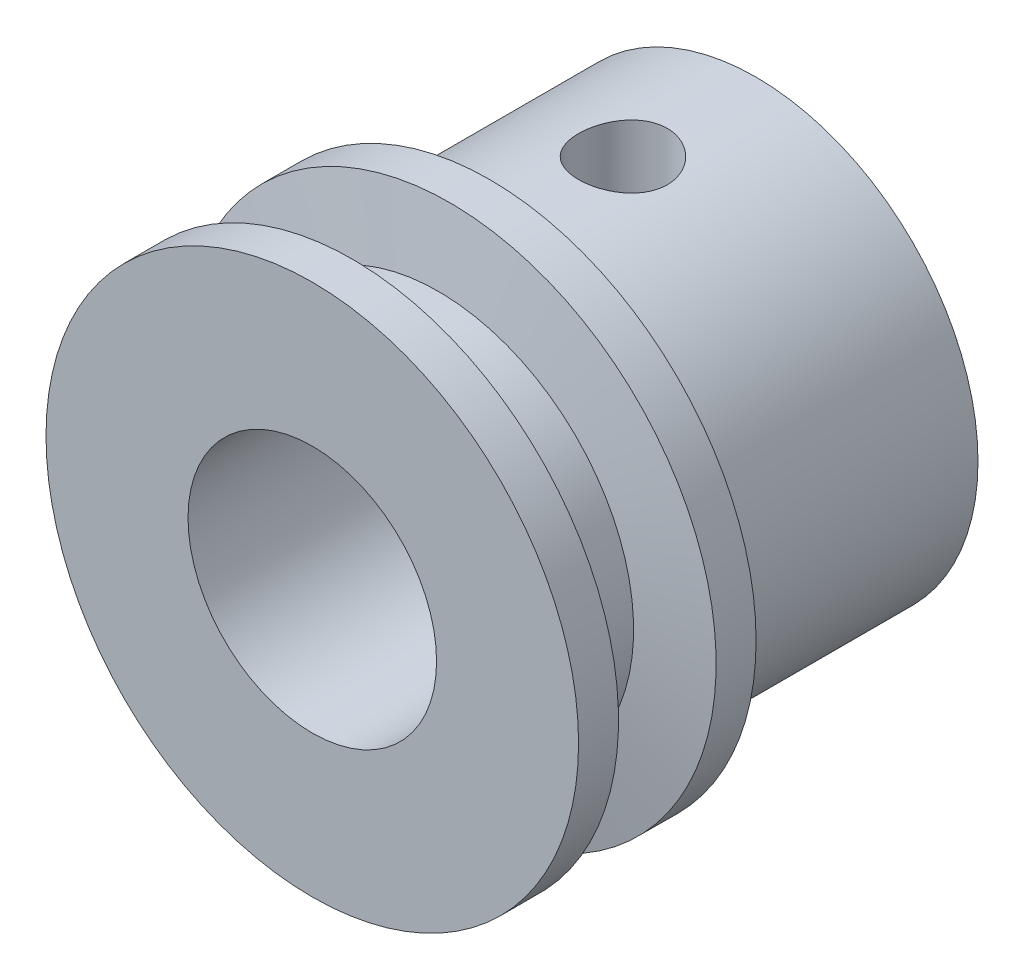
ISO-10303-21;
HEADER;
FILE_DESCRIPTION(('STEP AP214'),'2;1');
FILE_NAME('part.step','',(''),(''),'','','');
FILE_SCHEMA(('AUTOMOTIVE_DESIGN { 1 0 10303 214 1 1 1 1 }'));
ENDSEC;
DATA;
#1=APPLICATION_CONTEXT('core data for automotive mechanical design processes');
#2=APPLICATION_PROTOCOL_DEFINITION('international standard','automotive_design',2000,#1);
#3=PRODUCT_CONTEXT('',#1,'mechanical');
#4=PRODUCT('Part','Part','',(#3));
#5=PRODUCT_RELATED_PRODUCT_CATEGORY('part','',(#4));
#6=PRODUCT_DEFINITION_FORMATION('','',#4);
#7=PRODUCT_DEFINITION_CONTEXT('part definition',#1,'design');
#8=PRODUCT_DEFINITION('design','',#6,#7);
#9=PRODUCT_DEFINITION_SHAPE('','',#8);
#10=(LENGTH_UNIT() NAMED_UNIT(*) SI_UNIT(.MILLI.,.METRE.));
#11=(NAMED_UNIT(*) PLANE_ANGLE_UNIT() SI_UNIT($,.RADIAN.));
#12=(NAMED_UNIT(*) SI_UNIT($,.STERADIAN.) SOLID_ANGLE_UNIT());
#13=UNCERTAINTY_MEASURE_WITH_UNIT(LENGTH_MEASURE(1.E-05),#10,'distance_accuracy_value','');
#14=(GEOMETRIC_REPRESENTATION_CONTEXT(3) GLOBAL_UNCERTAINTY_ASSIGNED_CONTEXT((#13)) GLOBAL_UNIT_ASSIGNED_CONTEXT((#10,
#11,#12)) REPRESENTATION_CONTEXT('',''));
#15=CARTESIAN_POINT('',(0.,0.,0.));
#16=DIRECTION('',(0.,0.,1.));
#17=DIRECTION('',(1.,0.,0.));
#18=AXIS2_PLACEMENT_3D('',#15,#16,#17);
#19=CARTESIAN_POINT('',(0.,0.,10.));
#20=DIRECTION('',(0.,0.,-1.));
#21=DIRECTION('',(-1.,0.,0.));
#22=AXIS2_PLACEMENT_3D('',#19,#20,#21);
#23=CYLINDRICAL_SURFACE('',#22,15.);
#24=CARTESIAN_POINT('',(0.,0.,2.25));
#25=DIRECTION('',(0.,0.,-1.));
#26=DIRECTION('',(-1.,0.,0.));
#27=AXIS2_PLACEMENT_3D('',#24,#25,#26);
#28=CIRCLE('',#27,15.);
#29=CARTESIAN_POINT('',(-15.,0.,2.25));
#30=VERTEX_POINT('',#29);
#31=EDGE_CURVE('E61',#30,#30,#28,.T.);
#32=ORIENTED_EDGE('',*,*,#31,.T.);
#33=EDGE_LOOP('',(#32));
#34=FACE_BOUND('',#33,.T.);
#35=CARTESIAN_POINT('',(0.,0.,0.));
#36=DIRECTION('',(0.,0.,1.));
#37=DIRECTION('',(1.,0.,0.));
#38=AXIS2_PLACEMENT_3D('',#35,#36,#37);
#39=CIRCLE('',#38,15.);
#40=CARTESIAN_POINT('',(15.,0.,0.));
#41=VERTEX_POINT('',#40);
#42=EDGE_CURVE('E55',#41,#41,#39,.T.);
#43=ORIENTED_EDGE('',*,*,#42,.T.);
#44=EDGE_LOOP('',(#43));
#45=FACE_BOUND('',#44,.T.);
#46=ADVANCED_FACE('F34',(#34,#45),#23,.T.);
#47=CARTESIAN_POINT('',(0.,0.,10.));
#48=DIRECTION('',(0.,0.,1.));
#49=DIRECTION('',(1.,0.,0.));
#50=AXIS2_PLACEMENT_3D('',#47,#48,#49);
#51=PLANE('',#50);
#52=CARTESIAN_POINT('',(0.,0.,10.));
#53=DIRECTION('',(0.,0.,1.));
#54=DIRECTION('',(1.,0.,0.));
#55=AXIS2_PLACEMENT_3D('',#52,#53,#54);
#56=CIRCLE('',#55,15.);
#57=CARTESIAN_POINT('',(15.,0.,10.));
#58=VERTEX_POINT('',#57);
#59=EDGE_CURVE('E50',#58,#58,#56,.T.);
#60=ORIENTED_EDGE('',*,*,#59,.T.);
#61=EDGE_LOOP('',(#60));
#62=FACE_BOUND('',#61,.T.);
#63=CARTESIAN_POINT('',(0.,0.,10.));
#64=DIRECTION('',(0.,0.,1.));
#65=DIRECTION('',(1.,0.,0.));
#66=AXIS2_PLACEMENT_3D('',#63,#64,#65);
#67=CIRCLE('',#66,7.);
#68=CARTESIAN_POINT('',(7.,0.,10.));
#69=VERTEX_POINT('',#68);
#70=EDGE_CURVE('E73',#69,#69,#67,.T.);
#71=ORIENTED_EDGE('',*,*,#70,.F.);
#72=EDGE_LOOP('',(#71));
#73=FACE_BOUND('',#72,.T.);
#74=ADVANCED_FACE('F81',(#62,#73),#51,.T.);
#75=CARTESIAN_POINT('',(0.,0.,0.));
#76=DIRECTION('',(0.,0.,1.));
#77=DIRECTION('',(1.,0.,0.));
#78=AXIS2_PLACEMENT_3D('',#75,#76,#77);
#79=PLANE('',#78);
#80=CARTESIAN_POINT('',(0.,0.,0.));
#81=DIRECTION('',(0.,0.,-1.));
#82=DIRECTION('',(-1.,0.,0.));
#83=AXIS2_PLACEMENT_3D('',#80,#81,#82);
#84=CIRCLE('',#83,12.5);
#85=CARTESIAN_POINT('',(-12.5,0.,0.));
#86=VERTEX_POINT('',#85);
#87=EDGE_CURVE('E46',#86,#86,#84,.T.);
#88=ORIENTED_EDGE('',*,*,#87,.F.);
#89=EDGE_LOOP('',(#88));
#90=FACE_BOUND('',#89,.T.);
#91=ORIENTED_EDGE('',*,*,#42,.F.);
#92=EDGE_LOOP('',(#91));
#93=FACE_BOUND('',#92,.T.);
#94=ADVANCED_FACE('F79',(#90,#93),#79,.F.);
#95=CARTESIAN_POINT('',(0.,0.,7.75));
#96=DIRECTION('',(0.,0.,-1.));
#97=DIRECTION('',(-1.,0.,0.));
#98=AXIS2_PLACEMENT_3D('',#95,#96,#97);
#99=CIRCLE('',#98,15.);
#100=CARTESIAN_POINT('',(-15.,0.,7.75));
#101=VERTEX_POINT('',#100);
#102=EDGE_CURVE('E64',#101,#101,#99,.T.);
#103=ORIENTED_EDGE('',*,*,#102,.F.);
#104=EDGE_LOOP('',(#103));
#105=FACE_BOUND('',#104,.T.);
#106=ORIENTED_EDGE('',*,*,#59,.F.);
#107=EDGE_LOOP('',(#106));
#108=FACE_BOUND('',#107,.T.);
#109=ADVANCED_FACE('F36',(#105,#108),#23,.T.);
#110=CARTESIAN_POINT('',(0.,0.,10.));
#111=DIRECTION('',(0.,0.,-1.));
#112=DIRECTION('',(-1.,0.,0.));
#113=AXIS2_PLACEMENT_3D('',#110,#111,#112);
#114=CYLINDRICAL_SURFACE('',#113,7.);
#115=CARTESIAN_POINT('',(0.,7.,-5.00000000000001));
#116=CARTESIAN_POINT('',(-0.135839760518734,7.0000020295295,-4.99999717595815));
#117=CARTESIAN_POINT('',(-0.27165942994753,6.99601056603649,-5.01110675723282));
#118=CARTESIAN_POINT('',(-0.539264896606896,6.98048404948616,-5.05509128719208));
#119=CARTESIAN_POINT('',(-0.671050847614627,6.96894928437749,-5.08796540506481));
#120=CARTESIAN_POINT('',(-0.926692116674315,6.93958109810981,-5.17418514126746));
#121=CARTESIAN_POINT('',(-1.05056137145919,6.92175912724346,-5.22749355971995));
#122=CARTESIAN_POINT('',(-1.28759585298401,6.88161078032354,-5.35288871936762));
#123=CARTESIAN_POINT('',(-1.40075850640074,6.85928332539979,-5.42497995944901));
#124=CARTESIAN_POINT('',(-1.61758802805346,6.81147377429754,-5.5888431321164));
#125=CARTESIAN_POINT('',(-1.72078015672851,6.78590827445072,-5.68121873100537));
#126=CARTESIAN_POINT('',(-1.9105819932243,6.73493522536265,-5.8817463637898));
#127=CARTESIAN_POINT('',(-1.99718728701346,6.70952771990194,-5.98990258371639));
#128=CARTESIAN_POINT('',(-2.15423735561842,6.6608007016897,-6.22339779277569));
#129=CARTESIAN_POINT('',(-2.22403529794829,6.63758107761794,-6.34919474351648));
#130=CARTESIAN_POINT('',(-2.34127572230002,6.59714352451506,-6.61170366470435));
#131=CARTESIAN_POINT('',(-2.38872619231545,6.57992345154766,-6.74841171456772));
#132=CARTESIAN_POINT('',(-2.45809130448527,6.55432038222057,-7.02342283620247));
#133=CARTESIAN_POINT('',(-2.48090519407331,6.54562733379003,-7.16146930694311));
#134=CARTESIAN_POINT('',(-2.5031615222748,6.53715061879806,-7.4396836318238));
#135=CARTESIAN_POINT('',(-2.50261249605973,6.53736369856128,-7.57985069254155));
#136=CARTESIAN_POINT('',(-2.4788507897233,6.54640588297195,-7.85035565505249));
#137=CARTESIAN_POINT('',(-2.45685161763647,6.5547736366904,-7.98081835299974));
#138=CARTESIAN_POINT('',(-2.39280851055059,6.57842082174383,-8.23606152718334));
#139=CARTESIAN_POINT('',(-2.35076183734613,6.59370119723067,-8.36084122465079));
#140=CARTESIAN_POINT('',(-2.24709566844099,6.62975170487814,-8.60377374578571));
#141=CARTESIAN_POINT('',(-2.18514195933255,6.65061447775042,-8.72176960265853));
#142=CARTESIAN_POINT('',(-2.04365272690694,6.69544469696369,-8.94605638664971));
#143=CARTESIAN_POINT('',(-1.96411154980232,6.71941314064672,-9.0523435333074));
#144=CARTESIAN_POINT('',(-1.78403149047107,6.76952498465894,-9.25695959137112));
#145=CARTESIAN_POINT('',(-1.68251331515437,6.79571223474351,-9.35441785924915));
#146=CARTESIAN_POINT('',(-1.46426184534914,6.84605473605515,-9.53117168283478));
#147=CARTESIAN_POINT('',(-1.34752663019369,6.87020973014028,-9.61046494229875));
#148=CARTESIAN_POINT('',(-1.10010034292175,6.91416998722002,-9.7494806099392));
#149=CARTESIAN_POINT('',(-0.969249112425206,6.93391532170415,-9.80893823988978));
#150=CARTESIAN_POINT('',(-0.698523468127245,6.96639167687355,-9.90471582416036));
#151=CARTESIAN_POINT('',(-0.558652699053763,6.97912551125635,-9.94104506076262));
#152=CARTESIAN_POINT('',(-0.281205091813831,6.99566202632136,-9.98791915065958));
#153=CARTESIAN_POINT('',(-0.143850613169091,6.99987103999093,-9.99963813074565));
#154=CARTESIAN_POINT('',(0.130909371573394,7.00012297890716,-10.0003451219902));
#155=CARTESIAN_POINT('',(0.268314862212671,6.99616751856457,-9.98933762699177));
#156=CARTESIAN_POINT('',(0.534368698997769,6.98080349995239,-9.94581386267842));
#157=CARTESIAN_POINT('',(0.663155848081399,6.96965417819419,-9.91404524420184));
#158=CARTESIAN_POINT('',(0.913499444029993,6.94128245796679,-9.83086340526393));
#159=CARTESIAN_POINT('',(1.03505494970017,6.9240592709991,-9.77944763417142));
#160=CARTESIAN_POINT('',(1.27131790851501,6.88465739573328,-9.65684114659838));
#161=CARTESIAN_POINT('',(1.38573546298722,6.86235262462324,-9.58513351950063));
#162=CARTESIAN_POINT('',(1.6012793689737,6.81528395513799,-9.42457250489254));
#163=CARTESIAN_POINT('',(1.70240114063958,6.79051921453452,-9.33571323522615));
#164=CARTESIAN_POINT('',(1.89402292059752,6.73966040960453,-9.13787036727108));
#165=CARTESIAN_POINT('',(1.98368681906969,6.71356479866296,-9.02807528698032));
#166=CARTESIAN_POINT('',(2.14345525781598,6.6642787599771,-8.79445872999564));
#167=CARTESIAN_POINT('',(2.21355884309555,6.64108847411014,-8.67063656887139));
#168=CARTESIAN_POINT('',(2.33208686094211,6.60040332956607,-8.41193519076394));
#169=CARTESIAN_POINT('',(2.3804881075604,6.58291456759544,-8.27704432949013));
#170=CARTESIAN_POINT('',(2.45361419016747,6.55601442004241,-8.00023989927989));
#171=CARTESIAN_POINT('',(2.47835185463779,6.54659865821929,-7.85833017933767));
#172=CARTESIAN_POINT('',(2.50236255506862,6.53745596427834,-7.58047952062699));
#173=CARTESIAN_POINT('',(2.50304426978181,6.53719306756498,-7.44467678557558));
#174=CARTESIAN_POINT('',(2.48247035008868,6.54503319463772,-7.17500232934511));
#175=CARTESIAN_POINT('',(2.46121642244207,6.55313556754228,-7.04113045875185));
#176=CARTESIAN_POINT('',(2.39843007607193,6.57636700427786,-6.78249941462814));
#177=CARTESIAN_POINT('',(2.35741961008935,6.59131474248996,-6.65759590099421));
#178=CARTESIAN_POINT('',(2.2567264433817,6.62646329315119,-6.41635731813309));
#179=CARTESIAN_POINT('',(2.19703924956894,6.64666536944648,-6.3000243190558));
#180=CARTESIAN_POINT('',(2.05730313071904,6.69127230994833,-6.07307425004775));
#181=CARTESIAN_POINT('',(1.97640371595173,6.71583400336863,-5.96301195913709));
#182=CARTESIAN_POINT('',(1.79790863011923,6.76580411328317,-5.75757249533949));
#183=CARTESIAN_POINT('',(1.70030791033581,6.79121278393859,-5.662199779649));
#184=CARTESIAN_POINT('',(1.48566252339524,6.84145445667706,-5.48427809718344));
#185=CARTESIAN_POINT('',(1.36791750616704,6.86620367070764,-5.40254696020912));
#186=CARTESIAN_POINT('',(1.11951131249464,6.91104924401846,-5.26009233616212));
#187=CARTESIAN_POINT('',(0.988851114158933,6.93114595526313,-5.1993672597973));
#188=CARTESIAN_POINT('',(0.717646336524981,6.96446006180832,-5.10085968969142));
#189=CARTESIAN_POINT('',(0.577062560467782,6.97764821973896,-5.06317459183734));
#190=CARTESIAN_POINT('',(0.29097688113482,6.99541542277591,-5.0127511253612));
#191=CARTESIAN_POINT('',(0.145476919097826,6.99999782648543,-5.00000302439365));
#192=CARTESIAN_POINT('',(0.,7.,-5.00000000000001));
#193=B_SPLINE_CURVE_WITH_KNOTS('',3,(#115,#116,#117,#118,#119,#120,#121,#122,#123,#124,#125,
#126,#127,#128,#129,#130,#131,#132,#133,#134,#135,#136,#137,#138,#139,#140,#141,#142,#143,#144,
#145,#146,#147,#148,#149,#150,#151,#152,#153,#154,#155,#156,#157,#158,#159,#160,#161,#162,#163,
#164,#165,#166,#167,#168,#169,#170,#171,#172,#173,#174,#175,#176,#177,#178,#179,#180,#181,#182,
#183,#184,#185,#186,#187,#188,#189,#190,#191,#192),.UNSPECIFIED.,.T.,.F.,(4,2,2,2,2,2,2,2,2,2,2,
2,2,2,2,2,2,2,2,2,2,2,2,2,2,2,2,2,2,2,2,2,2,2,2,2,2,2,4),(0.,0.406983217142953,0.81395089951993,
1.22018120425629,1.62650889940498,2.0471457245952,2.46789433314937,2.90289606780334,
3.3377421950035,3.75611562378724,4.1743362095645,4.57019246497946,4.96610280426155,
5.36904149669467,5.77210990935866,6.19956653135136,6.62707715847136,7.06008524763624,
7.49291944485571,7.90458529912079,8.31616976000824,8.71369326802824,9.1112684008579,
9.5200585695312,9.92898918269312,10.3593838463852,10.7897995195909,11.2206739431307,
11.6513146487841,12.0566930957309,12.4620400035307,12.8572208236401,13.2524967861625,
13.6670344525245,14.0816976535746,14.5159343578492,14.9501382011315,15.3861650682913,
15.822021730055),.UNSPECIFIED.);
#194=CARTESIAN_POINT('',(0.,7.,-5.00000000000001));
#195=VERTEX_POINT('',#194);
#196=EDGE_CURVE('E128',#195,#195,#193,.T.);
#197=ORIENTED_EDGE('',*,*,#196,.F.);
#198=EDGE_LOOP('',(#197));
#199=FACE_BOUND('',#198,.T.);
#200=ORIENTED_EDGE('',*,*,#70,.T.);
#201=EDGE_LOOP('',(#200));
#202=FACE_BOUND('',#201,.T.);
#203=CARTESIAN_POINT('',(0.,0.,-15.));
#204=DIRECTION('',(0.,0.,-1.));
#205=DIRECTION('',(-1.,0.,0.));
#206=AXIS2_PLACEMENT_3D('',#203,#204,#205);
#207=CIRCLE('',#206,7.);
#208=CARTESIAN_POINT('',(-7.,0.,-15.));
#209=VERTEX_POINT('',#208);
#210=EDGE_CURVE('E126',#209,#209,#207,.T.);
#211=ORIENTED_EDGE('',*,*,#210,.T.);
#212=EDGE_LOOP('',(#211));
#213=FACE_BOUND('',#212,.T.);
#214=ADVANCED_FACE('F87',(#199,#202,#213),#114,.F.);
#215=CARTESIAN_POINT('',(0.,0.,2.9));
#216=DIRECTION('',(0.,0.,-1.));
#217=DIRECTION('',(-1.,0.,0.));
#218=AXIS2_PLACEMENT_3D('',#215,#216,#217);
#219=CONICAL_SURFACE('',#218,11.,1.40970442225732);
#220=ORIENTED_EDGE('',*,*,#31,.F.);
#221=EDGE_LOOP('',(#220));
#222=FACE_BOUND('',#221,.T.);
#223=CARTESIAN_POINT('',(0.,0.,2.9));
#224=DIRECTION('',(0.,0.,-1.));
#225=DIRECTION('',(-1.,0.,0.));
#226=AXIS2_PLACEMENT_3D('',#223,#224,#225);
#227=CIRCLE('',#226,11.);
#228=CARTESIAN_POINT('',(-11.,0.,2.9));
#229=VERTEX_POINT('',#228);
#230=EDGE_CURVE('E70',#229,#229,#227,.T.);
#231=ORIENTED_EDGE('',*,*,#230,.T.);
#232=EDGE_LOOP('',(#231));
#233=FACE_BOUND('',#232,.T.);
#234=ADVANCED_FACE('F97',(#222,#233),#219,.T.);
#235=CARTESIAN_POINT('',(0.,0.,0.));
#236=DIRECTION('',(0.,0.,-1.));
#237=DIRECTION('',(-1.,0.,0.));
#238=AXIS2_PLACEMENT_3D('',#235,#236,#237);
#239=CYLINDRICAL_SURFACE('',#238,11.);
#240=ORIENTED_EDGE('',*,*,#230,.F.);
#241=EDGE_LOOP('',(#240));
#242=FACE_BOUND('',#241,.T.);
#243=CARTESIAN_POINT('',(0.,0.,7.1));
#244=DIRECTION('',(0.,0.,-1.));
#245=DIRECTION('',(-1.,0.,0.));
#246=AXIS2_PLACEMENT_3D('',#243,#244,#245);
#247=CIRCLE('',#246,11.);
#248=CARTESIAN_POINT('',(-11.,0.,7.1));
#249=VERTEX_POINT('',#248);
#250=EDGE_CURVE('E67',#249,#249,#247,.T.);
#251=ORIENTED_EDGE('',*,*,#250,.T.);
#252=EDGE_LOOP('',(#251));
#253=FACE_BOUND('',#252,.T.);
#254=ADVANCED_FACE('F100',(#242,#253),#239,.T.);
#255=CARTESIAN_POINT('',(0.,0.,7.75));
#256=DIRECTION('',(0.,0.,1.));
#257=DIRECTION('',(1.,0.,0.));
#258=AXIS2_PLACEMENT_3D('',#255,#256,#257);
#259=CONICAL_SURFACE('',#258,15.,1.40970442225732);
#260=ORIENTED_EDGE('',*,*,#250,.F.);
#261=EDGE_LOOP('',(#260));
#262=FACE_BOUND('',#261,.T.);
#263=ORIENTED_EDGE('',*,*,#102,.T.);
#264=EDGE_LOOP('',(#263));
#265=FACE_BOUND('',#264,.T.);
#266=ADVANCED_FACE('F106',(#262,#265),#259,.T.);
#267=CARTESIAN_POINT('',(0.,0.,-15.));
#268=DIRECTION('',(0.,0.,-1.));
#269=DIRECTION('',(-1.,0.,0.));
#270=AXIS2_PLACEMENT_3D('',#267,#268,#269);
#271=PLANE('',#270);
#272=CARTESIAN_POINT('',(0.,0.,-15.));
#273=DIRECTION('',(0.,0.,-1.));
#274=DIRECTION('',(-1.,0.,0.));
#275=AXIS2_PLACEMENT_3D('',#272,#273,#274);
#276=CIRCLE('',#275,12.5);
#277=CARTESIAN_POINT('',(-12.5,0.,-15.));
#278=VERTEX_POINT('',#277);
#279=EDGE_CURVE('E59',#278,#278,#276,.T.);
#280=ORIENTED_EDGE('',*,*,#279,.T.);
#281=EDGE_LOOP('',(#280));
#282=FACE_BOUND('',#281,.T.);
#283=ORIENTED_EDGE('',*,*,#210,.F.);
#284=EDGE_LOOP('',(#283));
#285=FACE_BOUND('',#284,.T.);
#286=ADVANCED_FACE('F112',(#282,#285),#271,.T.);
#287=CARTESIAN_POINT('',(0.,0.,-15.));
#288=DIRECTION('',(0.,0.,1.));
#289=DIRECTION('',(1.,0.,0.));
#290=AXIS2_PLACEMENT_3D('',#287,#288,#289);
#291=CYLINDRICAL_SURFACE('',#290,12.5);
#292=CARTESIAN_POINT('',(0.,12.5,-5.00000000000001));
#293=CARTESIAN_POINT('',(-0.138942266981583,12.4999974395218,-5.00000511124587));
#294=CARTESIAN_POINT('',(-0.277949150503805,12.4976596294558,-5.01162210741912));
#295=CARTESIAN_POINT('',(-0.552033769222547,12.4885591405808,-5.05774625028812));
#296=CARTESIAN_POINT('',(-0.687108293853388,12.4817929465047,-5.09227158200378));
#297=CARTESIAN_POINT('',(-0.94932576315828,12.4645912319572,-5.18310318405198));
#298=CARTESIAN_POINT('',(-1.07647616983283,12.454159226918,-5.23938859211172));
#299=CARTESIAN_POINT('',(-1.31951997216056,12.4307599508829,-5.37208061877824));
#300=CARTESIAN_POINT('',(-1.43541403768953,12.4177928308927,-5.44848603901802));
#301=CARTESIAN_POINT('',(-1.65423369328716,12.3905541332492,-5.62034623572859));
#302=CARTESIAN_POINT('',(-1.75698487789631,12.3762686376087,-5.71602088847801));
#303=CARTESIAN_POINT('',(-1.94509189152007,12.3481045113147,-5.92323104097926));
#304=CARTESIAN_POINT('',(-2.03044636192606,12.3342259125106,-6.0347677783378));
#305=CARTESIAN_POINT('',(-2.18207938336905,12.3083110453154,-6.27179048252969));
#306=CARTESIAN_POINT('',(-2.24817734716466,12.2962926841237,-6.3973941094909));
#307=CARTESIAN_POINT('',(-2.35826416645076,12.2756567014604,-6.6582045475102));
#308=CARTESIAN_POINT('',(-2.40225520609309,12.267038744049,-6.79341040836586));
#309=CARTESIAN_POINT('',(-2.46631324971206,12.2543201313051,-7.06771090976979));
#310=CARTESIAN_POINT('',(-2.48668624489694,12.2501617526797,-7.20673136035557));
#311=CARTESIAN_POINT('',(-2.50388031931529,12.2466593765157,-7.48627455341086));
#312=CARTESIAN_POINT('',(-2.50070380678374,12.247314886696,-7.62679714080036));
#313=CARTESIAN_POINT('',(-2.47113643275454,12.2533137787046,-7.90311697005251));
#314=CARTESIAN_POINT('',(-2.44509635060976,12.2585863214691,-8.03895351406828));
#315=CARTESIAN_POINT('',(-2.37109471155762,12.273113654,-8.3042901916575));
#316=CARTESIAN_POINT('',(-2.3231321077517,12.2823686339445,-8.43379002229752));
#317=CARTESIAN_POINT('',(-2.20631195918679,12.3038904625102,-8.683788154259));
#318=CARTESIAN_POINT('',(-2.13731537808028,12.3161772453426,-8.80421969892293));
#319=CARTESIAN_POINT('',(-1.98048393643169,12.3423654693266,-9.03192712493203));
#320=CARTESIAN_POINT('',(-1.89264691089207,12.3562670959591,-9.13920149212789));
#321=CARTESIAN_POINT('',(-1.69874983640146,12.3844255310365,-9.33957350614234));
#322=CARTESIAN_POINT('',(-1.59239040303111,12.3986842302726,-9.43238141964782));
#323=CARTESIAN_POINT('',(-1.36546256015502,12.4257212178602,-9.59888461575306));
#324=CARTESIAN_POINT('',(-1.24489396844847,12.4384994872243,-9.67257965323394));
#325=CARTESIAN_POINT('',(-0.992648467197298,12.4611672540222,-9.79881877306493));
#326=CARTESIAN_POINT('',(-0.860954548963246,12.4710522212068,-9.85132973411134));
#327=CARTESIAN_POINT('',(-0.590372441121659,12.4867852246965,-9.93340118509641));
#328=CARTESIAN_POINT('',(-0.451485125181122,12.4926337500133,-9.96296445518406));
#329=CARTESIAN_POINT('',(-0.172948514067875,12.4995667966717,-9.99789113448569));
#330=CARTESIAN_POINT('',(-0.0333508208139397,12.5007293663117,-10.0036510488507));
#331=CARTESIAN_POINT('',(0.244812335481785,12.4983762982526,-9.99187535264454));
#332=CARTESIAN_POINT('',(0.383377856109483,12.4948609235362,-9.9743410516185));
#333=CARTESIAN_POINT('',(0.65426414986635,12.4835958002004,-9.9168040661401));
#334=CARTESIAN_POINT('',(0.786629870849755,12.4758844101052,-9.87700482875524));
#335=CARTESIAN_POINT('',(1.04280906874916,12.4570888015258,-9.77629004336047));
#336=CARTESIAN_POINT('',(1.16662190409385,12.4460043303557,-9.71537291330792));
#337=CARTESIAN_POINT('',(1.40385293421554,12.4214977883324,-9.57329377337171));
#338=CARTESIAN_POINT('',(1.51712531688047,12.4080487609263,-9.49189304740263));
#339=CARTESIAN_POINT('',(1.72854504779801,12.3803683707471,-9.31147702198179));
#340=CARTESIAN_POINT('',(1.8266907723269,12.3661369242097,-9.21245983400033));
#341=CARTESIAN_POINT('',(2.00660147693544,12.3382325889241,-8.99781662027218));
#342=CARTESIAN_POINT('',(2.08809425612163,12.3245715058326,-8.88196063944665));
#343=CARTESIAN_POINT('',(2.23046355012801,12.2996047949049,-8.6379715966083));
#344=CARTESIAN_POINT('',(2.29134088980725,12.2882990728336,-8.50983902606611));
#345=CARTESIAN_POINT('',(2.39037960395489,12.2694185146096,-8.24557938462613));
#346=CARTESIAN_POINT('',(2.42865874947762,12.2618243718047,-8.1094978969742));
#347=CARTESIAN_POINT('',(2.48177162906798,12.2511859198006,-7.83266636627274));
#348=CARTESIAN_POINT('',(2.49660842056277,12.2481410172778,-7.69191693447663));
#349=CARTESIAN_POINT('',(2.50230227716866,12.2469787407845,-7.4124778386392));
#350=CARTESIAN_POINT('',(2.49358947017723,12.2487729797325,-7.27379712768248));
#351=CARTESIAN_POINT('',(2.45338076025015,12.2568893371153,-6.99992087523744));
#352=CARTESIAN_POINT('',(2.42188504032324,12.2632114191792,-6.86472530576299));
#353=CARTESIAN_POINT('',(2.33719642124738,12.279631605479,-6.60193072189864));
#354=CARTESIAN_POINT('',(2.28405626679336,12.2897205254708,-6.47431409874396));
#355=CARTESIAN_POINT('',(2.157636611504,12.3125428743543,-6.2297406981639));
#356=CARTESIAN_POINT('',(2.0843554219372,12.3252765249724,-6.11278481568716));
#357=CARTESIAN_POINT('',(1.91826478696603,12.3522240130806,-5.89071106962422));
#358=CARTESIAN_POINT('',(1.82514471808795,12.3664593227425,-5.78582808683102));
#359=CARTESIAN_POINT('',(1.62266092253285,12.3946520467989,-5.59303448617708));
#360=CARTESIAN_POINT('',(1.51329346788333,12.4086093965796,-5.50512777420682));
#361=CARTESIAN_POINT('',(1.28004407272061,12.4348458096993,-5.34791339013389));
#362=CARTESIAN_POINT('',(1.15602221107458,12.4471057804812,-5.27880999179994));
#363=CARTESIAN_POINT('',(0.897915902351829,12.468378127125,-5.16253469350853));
#364=CARTESIAN_POINT('',(0.763840652157813,12.4773934284654,-5.11534302616877));
#365=CARTESIAN_POINT('',(0.524553722309448,12.4894093148843,-5.05337012988822));
#366=CARTESIAN_POINT('',(0.420704160034461,12.4933575789613,-5.03339201573061));
#367=CARTESIAN_POINT('',(0.211248813025167,12.4986538534973,-5.0067052191041));
#368=CARTESIAN_POINT('',(0.105643084371548,12.5000019468289,-4.99999611372559));
#369=CARTESIAN_POINT('',(0.,12.5,-5.00000000000001));
#370=B_SPLINE_CURVE_WITH_KNOTS('',3,(#292,#293,#294,#295,#296,#297,#298,#299,#300,#301,#302,
#303,#304,#305,#306,#307,#308,#309,#310,#311,#312,#313,#314,#315,#316,#317,#318,#319,#320,#321,
#322,#323,#324,#325,#326,#327,#328,#329,#330,#331,#332,#333,#334,#335,#336,#337,#338,#339,#340,
#341,#342,#343,#344,#345,#346,#347,#348,#349,#350,#351,#352,#353,#354,#355,#356,#357,#358,#359,
#360,#361,#362,#363,#364,#365,#366,#367,#368,#369),.UNSPECIFIED.,.T.,.F.,(4,2,2,2,2,2,2,2,2,2,2,
2,2,2,2,2,2,2,2,2,2,2,2,2,2,2,2,2,2,2,2,2,2,2,2,2,2,2,4),(0.,0.416440326653145,
0.833211626728306,1.24958433812585,1.66593225557715,2.08733167528046,2.50876399186841,
2.93402987514806,3.35925373412993,3.77890462758967,4.19851260703062,4.61179317515695,
5.02509348134323,5.4411872550898,5.85732886874175,6.28095631228375,6.70458918849549,
7.12888187135058,7.55312314245088,7.97026839190661,8.38739019144667,8.80076134876806,
9.21416348040054,9.63262665083394,10.0511347086482,10.4760157144806,10.9008797180866,
11.3235095258181,11.7460842082603,12.1609930641925,12.5758985873152,12.9897990313277,
13.4037341895466,13.8247019059785,14.2457663633232,14.6712374168909,15.0963238879379,
15.4129693822473,15.7296047842749),.UNSPECIFIED.);
#371=CARTESIAN_POINT('',(0.,12.5,-5.00000000000001));
#372=VERTEX_POINT('',#371);
#373=EDGE_CURVE('E10',#372,#372,#370,.T.);
#374=ORIENTED_EDGE('',*,*,#373,.T.);
#375=EDGE_LOOP('',(#374));
#376=FACE_BOUND('',#375,.T.);
#377=ORIENTED_EDGE('',*,*,#279,.F.);
#378=EDGE_LOOP('',(#377));
#379=FACE_BOUND('',#378,.T.);
#380=ORIENTED_EDGE('',*,*,#87,.T.);
#381=EDGE_LOOP('',(#380));
#382=FACE_BOUND('',#381,.T.);
#383=ADVANCED_FACE('F140',(#376,#379,#382),#291,.T.);
#384=CARTESIAN_POINT('',(0.,12.5,-7.5));
#385=DIRECTION('',(0.,1.,0.));
#386=DIRECTION('',(0.,0.,1.));
#387=AXIS2_PLACEMENT_3D('',#384,#385,#386);
#388=CYLINDRICAL_SURFACE('',#387,2.49999999999999);
#389=ORIENTED_EDGE('',*,*,#196,.T.);
#390=EDGE_LOOP('',(#389));
#391=FACE_BOUND('',#390,.T.);
#392=ORIENTED_EDGE('',*,*,#373,.F.);
#393=EDGE_LOOP('',(#392));
#394=FACE_BOUND('',#393,.T.);
#395=ADVANCED_FACE('F136',(#391,#394),#388,.F.);
#396=CLOSED_SHELL('',(#46,#74,#94,#109,#214,#234,#254,#266,#286,#383,#395));
#397=MANIFOLD_SOLID_BREP('B2',#396);
#398=ADVANCED_BREP_SHAPE_REPRESENTATION('',(#18,#397),#14);
#399=SHAPE_DEFINITION_REPRESENTATION(#9,#398);
ENDSEC;
END-ISO-10303-21;
